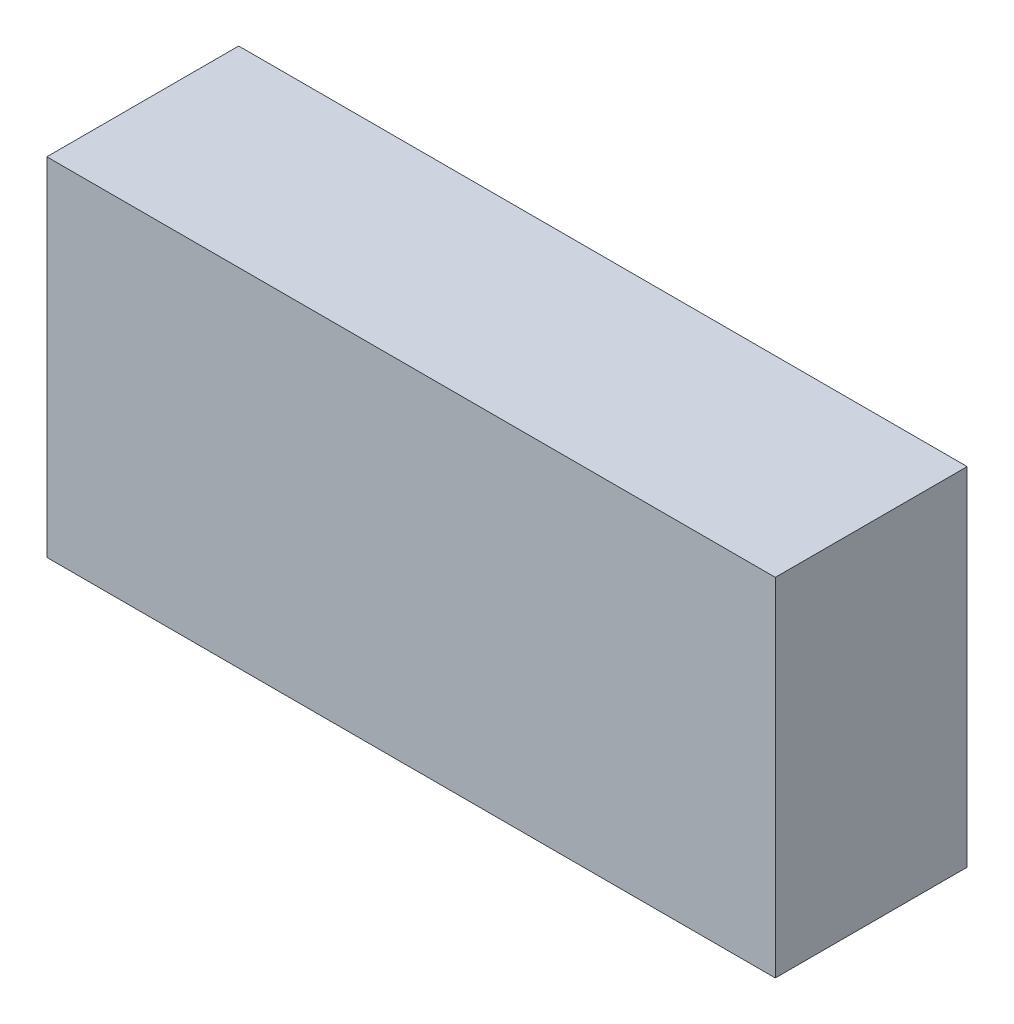
ISO-10303-21;
HEADER;
FILE_DESCRIPTION(('STEP AP214'),'2;1');
FILE_NAME('part.step','',(''),(''),'','','');
FILE_SCHEMA(('AUTOMOTIVE_DESIGN { 1 0 10303 214 1 1 1 1 }'));
ENDSEC;
DATA;
#1=APPLICATION_CONTEXT('core data for automotive mechanical design processes');
#2=APPLICATION_PROTOCOL_DEFINITION('international standard','automotive_design',2000,#1);
#3=PRODUCT_CONTEXT('',#1,'mechanical');
#4=PRODUCT('Part','Part','',(#3));
#5=PRODUCT_RELATED_PRODUCT_CATEGORY('part','',(#4));
#6=PRODUCT_DEFINITION_FORMATION('','',#4);
#7=PRODUCT_DEFINITION_CONTEXT('part definition',#1,'design');
#8=PRODUCT_DEFINITION('design','',#6,#7);
#9=PRODUCT_DEFINITION_SHAPE('','',#8);
#10=(LENGTH_UNIT() NAMED_UNIT(*) SI_UNIT(.MILLI.,.METRE.));
#11=(NAMED_UNIT(*) PLANE_ANGLE_UNIT() SI_UNIT($,.RADIAN.));
#12=(NAMED_UNIT(*) SI_UNIT($,.STERADIAN.) SOLID_ANGLE_UNIT());
#13=UNCERTAINTY_MEASURE_WITH_UNIT(LENGTH_MEASURE(1.E-05),#10,'distance_accuracy_value','');
#14=(GEOMETRIC_REPRESENTATION_CONTEXT(3) GLOBAL_UNCERTAINTY_ASSIGNED_CONTEXT((#13)) GLOBAL_UNIT_ASSIGNED_CONTEXT((#10,
#11,#12)) REPRESENTATION_CONTEXT('',''));
#15=CARTESIAN_POINT('',(0.,0.,0.));
#16=DIRECTION('',(0.,0.,1.));
#17=DIRECTION('',(1.,0.,0.));
#18=AXIS2_PLACEMENT_3D('',#15,#16,#17);
#19=CARTESIAN_POINT('',(-1.8984,-0.9,1.));
#20=DIRECTION('',(1.,0.,0.));
#21=DIRECTION('',(0.,0.,-1.));
#22=AXIS2_PLACEMENT_3D('',#19,#20,#21);
#23=PLANE('',#22);
#24=DIRECTION('',(0.,-1.,0.));
#25=VECTOR('',#24,1.);
#26=CARTESIAN_POINT('',(-1.8984,-0.9,0.));
#27=LINE('',#26,#25);
#28=CARTESIAN_POINT('',(-1.8984,0.9084,0.));
#29=VERTEX_POINT('',#28);
#30=CARTESIAN_POINT('',(-1.8984,-0.9,0.));
#31=VERTEX_POINT('',#30);
#32=EDGE_CURVE('E95',#29,#31,#27,.T.);
#33=ORIENTED_EDGE('',*,*,#32,.T.);
#34=DIRECTION('',(0.,0.,-1.));
#35=VECTOR('',#34,1.);
#36=CARTESIAN_POINT('',(-1.8984,-0.9,1.));
#37=LINE('',#36,#35);
#38=CARTESIAN_POINT('',(-1.8984,-0.9,1.));
#39=VERTEX_POINT('',#38);
#40=EDGE_CURVE('E11',#39,#31,#37,.T.);
#41=ORIENTED_EDGE('',*,*,#40,.F.);
#42=DIRECTION('',(0.,-1.,0.));
#43=VECTOR('',#42,1.);
#44=CARTESIAN_POINT('',(-1.8984,-0.9,1.));
#45=LINE('',#44,#43);
#46=CARTESIAN_POINT('',(-1.8984,0.9084,1.));
#47=VERTEX_POINT('',#46);
#48=EDGE_CURVE('E83',#47,#39,#45,.T.);
#49=ORIENTED_EDGE('',*,*,#48,.F.);
#50=DIRECTION('',(0.,0.,-1.));
#51=VECTOR('',#50,1.);
#52=CARTESIAN_POINT('',(-1.8984,0.9084,1.));
#53=LINE('',#52,#51);
#54=EDGE_CURVE('E91',#47,#29,#53,.T.);
#55=ORIENTED_EDGE('',*,*,#54,.T.);
#56=EDGE_LOOP('',(#33,#41,#49,#55));
#57=FACE_BOUND('',#56,.T.);
#58=ADVANCED_FACE('F32',(#57),#23,.F.);
#59=CARTESIAN_POINT('',(1.8984,-0.9,1.));
#60=DIRECTION('',(0.,1.,0.));
#61=DIRECTION('',(0.,0.,1.));
#62=AXIS2_PLACEMENT_3D('',#59,#60,#61);
#63=PLANE('',#62);
#64=DIRECTION('',(1.,0.,0.));
#65=VECTOR('',#64,1.);
#66=CARTESIAN_POINT('',(1.8984,-0.9,0.));
#67=LINE('',#66,#65);
#68=CARTESIAN_POINT('',(1.8984,-0.9,0.));
#69=VERTEX_POINT('',#68);
#70=EDGE_CURVE('E87',#31,#69,#67,.T.);
#71=ORIENTED_EDGE('',*,*,#70,.T.);
#72=DIRECTION('',(0.,0.,-1.));
#73=VECTOR('',#72,1.);
#74=CARTESIAN_POINT('',(1.8984,-0.9,1.));
#75=LINE('',#74,#73);
#76=CARTESIAN_POINT('',(1.8984,-0.9,1.));
#77=VERTEX_POINT('',#76);
#78=EDGE_CURVE('E40',#77,#69,#75,.T.);
#79=ORIENTED_EDGE('',*,*,#78,.F.);
#80=DIRECTION('',(1.,0.,0.));
#81=VECTOR('',#80,1.);
#82=CARTESIAN_POINT('',(1.8984,-0.9,1.));
#83=LINE('',#82,#81);
#84=EDGE_CURVE('E78',#39,#77,#83,.T.);
#85=ORIENTED_EDGE('',*,*,#84,.F.);
#86=ORIENTED_EDGE('',*,*,#40,.T.);
#87=EDGE_LOOP('',(#71,#79,#85,#86));
#88=FACE_BOUND('',#87,.T.);
#89=ADVANCED_FACE('F86',(#88),#63,.F.);
#90=CARTESIAN_POINT('',(1.8984,0.9084,1.));
#91=DIRECTION('',(-1.,0.,0.));
#92=DIRECTION('',(0.,0.,1.));
#93=AXIS2_PLACEMENT_3D('',#90,#91,#92);
#94=PLANE('',#93);
#95=DIRECTION('',(0.,1.,0.));
#96=VECTOR('',#95,1.);
#97=CARTESIAN_POINT('',(1.8984,0.9084,0.));
#98=LINE('',#97,#96);
#99=CARTESIAN_POINT('',(1.8984,0.9084,0.));
#100=VERTEX_POINT('',#99);
#101=EDGE_CURVE('E65',#69,#100,#98,.T.);
#102=ORIENTED_EDGE('',*,*,#101,.T.);
#103=DIRECTION('',(0.,0.,-1.));
#104=VECTOR('',#103,1.);
#105=CARTESIAN_POINT('',(1.8984,0.9084,1.));
#106=LINE('',#105,#104);
#107=CARTESIAN_POINT('',(1.8984,0.9084,1.));
#108=VERTEX_POINT('',#107);
#109=EDGE_CURVE('E88',#108,#100,#106,.T.);
#110=ORIENTED_EDGE('',*,*,#109,.F.);
#111=DIRECTION('',(0.,1.,0.));
#112=VECTOR('',#111,1.);
#113=CARTESIAN_POINT('',(1.8984,0.9084,1.));
#114=LINE('',#113,#112);
#115=EDGE_CURVE('E81',#77,#108,#114,.T.);
#116=ORIENTED_EDGE('',*,*,#115,.F.);
#117=ORIENTED_EDGE('',*,*,#78,.T.);
#118=EDGE_LOOP('',(#102,#110,#116,#117));
#119=FACE_BOUND('',#118,.T.);
#120=ADVANCED_FACE('F89',(#119),#94,.F.);
#121=CARTESIAN_POINT('',(-1.8984,0.9084,1.));
#122=DIRECTION('',(0.,-1.,0.));
#123=DIRECTION('',(0.,0.,-1.));
#124=AXIS2_PLACEMENT_3D('',#121,#122,#123);
#125=PLANE('',#124);
#126=DIRECTION('',(-1.,0.,0.));
#127=VECTOR('',#126,1.);
#128=CARTESIAN_POINT('',(-1.8984,0.9084,0.));
#129=LINE('',#128,#127);
#130=EDGE_CURVE('E71',#100,#29,#129,.T.);
#131=ORIENTED_EDGE('',*,*,#130,.T.);
#132=ORIENTED_EDGE('',*,*,#54,.F.);
#133=DIRECTION('',(-1.,0.,0.));
#134=VECTOR('',#133,1.);
#135=CARTESIAN_POINT('',(-1.8984,0.9084,1.));
#136=LINE('',#135,#134);
#137=EDGE_CURVE('E48',#108,#47,#136,.T.);
#138=ORIENTED_EDGE('',*,*,#137,.F.);
#139=ORIENTED_EDGE('',*,*,#109,.T.);
#140=EDGE_LOOP('',(#131,#132,#138,#139));
#141=FACE_BOUND('',#140,.T.);
#142=ADVANCED_FACE('F102',(#141),#125,.F.);
#143=CARTESIAN_POINT('',(0.,0.,1.));
#144=DIRECTION('',(0.,0.,-1.));
#145=DIRECTION('',(-1.,0.,0.));
#146=AXIS2_PLACEMENT_3D('',#143,#144,#145);
#147=PLANE('',#146);
#148=ORIENTED_EDGE('',*,*,#48,.T.);
#149=ORIENTED_EDGE('',*,*,#84,.T.);
#150=ORIENTED_EDGE('',*,*,#115,.T.);
#151=ORIENTED_EDGE('',*,*,#137,.T.);
#152=EDGE_LOOP('',(#148,#149,#150,#151));
#153=FACE_BOUND('',#152,.T.);
#154=ADVANCED_FACE('F79',(#153),#147,.F.);
#155=CARTESIAN_POINT('',(0.,0.,0.));
#156=DIRECTION('',(0.,0.,-1.));
#157=DIRECTION('',(-1.,0.,0.));
#158=AXIS2_PLACEMENT_3D('',#155,#156,#157);
#159=PLANE('',#158);
#160=ORIENTED_EDGE('',*,*,#32,.F.);
#161=ORIENTED_EDGE('',*,*,#130,.F.);
#162=ORIENTED_EDGE('',*,*,#101,.F.);
#163=ORIENTED_EDGE('',*,*,#70,.F.);
#164=EDGE_LOOP('',(#160,#161,#162,#163));
#165=FACE_BOUND('',#164,.T.);
#166=ADVANCED_FACE('F105',(#165),#159,.T.);
#167=CLOSED_SHELL('',(#58,#89,#120,#142,#154,#166));
#168=MANIFOLD_SOLID_BREP('B2',#167);
#169=ADVANCED_BREP_SHAPE_REPRESENTATION('',(#18,#168),#14);
#170=SHAPE_DEFINITION_REPRESENTATION(#9,#169);
ENDSEC;
END-ISO-10303-21;
